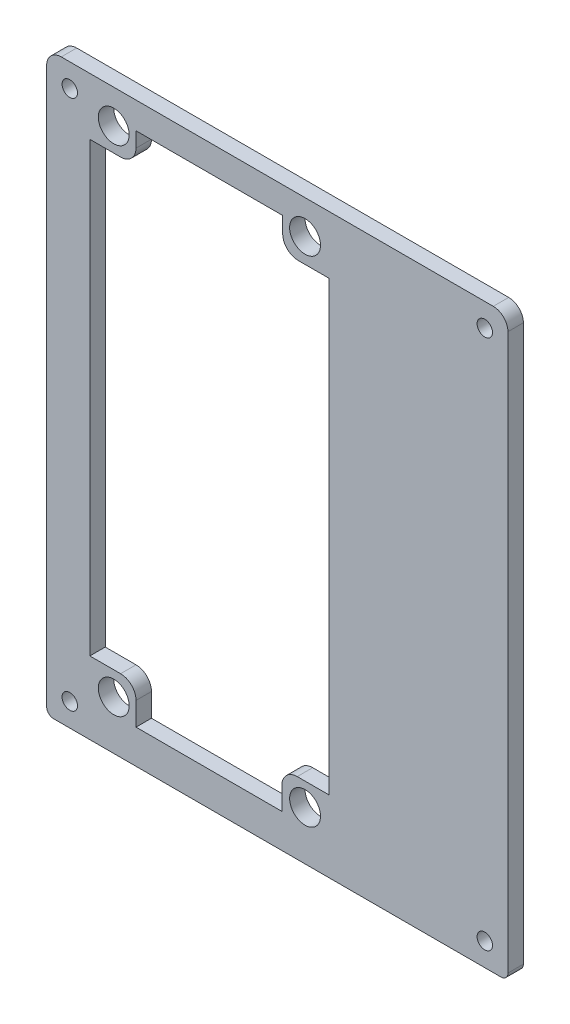
ISO-10303-21;
HEADER;
FILE_DESCRIPTION(('STEP AP214'),'2;1');
FILE_NAME('part.step','',(''),(''),'','','');
FILE_SCHEMA(('AUTOMOTIVE_DESIGN { 1 0 10303 214 1 1 1 1 }'));
ENDSEC;
DATA;
#1=APPLICATION_CONTEXT('core data for automotive mechanical design processes');
#2=APPLICATION_PROTOCOL_DEFINITION('international standard','automotive_design',2000,#1);
#3=PRODUCT_CONTEXT('',#1,'mechanical');
#4=PRODUCT('Part','Part','',(#3));
#5=PRODUCT_RELATED_PRODUCT_CATEGORY('part','',(#4));
#6=PRODUCT_DEFINITION_FORMATION('','',#4);
#7=PRODUCT_DEFINITION_CONTEXT('part definition',#1,'design');
#8=PRODUCT_DEFINITION('design','',#6,#7);
#9=PRODUCT_DEFINITION_SHAPE('','',#8);
#10=(LENGTH_UNIT() NAMED_UNIT(*) SI_UNIT(.MILLI.,.METRE.));
#11=(NAMED_UNIT(*) PLANE_ANGLE_UNIT() SI_UNIT($,.RADIAN.));
#12=(NAMED_UNIT(*) SI_UNIT($,.STERADIAN.) SOLID_ANGLE_UNIT());
#13=UNCERTAINTY_MEASURE_WITH_UNIT(LENGTH_MEASURE(1.E-05),#10,'distance_accuracy_value','');
#14=(GEOMETRIC_REPRESENTATION_CONTEXT(3) GLOBAL_UNCERTAINTY_ASSIGNED_CONTEXT((#13)) GLOBAL_UNIT_ASSIGNED_CONTEXT((#10,
#11,#12)) REPRESENTATION_CONTEXT('',''));
#15=CARTESIAN_POINT('',(0.,0.,0.));
#16=DIRECTION('',(0.,0.,1.));
#17=DIRECTION('',(1.,0.,0.));
#18=AXIS2_PLACEMENT_3D('',#15,#16,#17);
#19=CARTESIAN_POINT('',(-56.4735723656355,0.00392757981874936,2.));
#20=DIRECTION('',(0.,0.,-1.));
#21=DIRECTION('',(-1.,0.,0.));
#22=AXIS2_PLACEMENT_3D('',#19,#20,#21);
#23=PLANE('',#22);
#24=DIRECTION('',(0.,-1.,0.));
#25=VECTOR('',#24,1.);
#26=CARTESIAN_POINT('',(-45.7863826886566,0.00392757981874936,2.));
#27=LINE('',#26,#25);
#28=CARTESIAN_POINT('',(-45.7863826886566,6.50392757981872,2.));
#29=VERTEX_POINT('',#28);
#30=CARTESIAN_POINT('',(-45.7863826886566,3.50392757981873,2.));
#31=VERTEX_POINT('',#30);
#32=EDGE_CURVE('E540',#29,#31,#27,.T.);
#33=ORIENTED_EDGE('',*,*,#32,.F.);
#34=CARTESIAN_POINT('',(-47.7863826886566,6.50392757981872,2.));
#35=DIRECTION('',(0.,0.,-1.));
#36=DIRECTION('',(-1.,0.,0.));
#37=AXIS2_PLACEMENT_3D('',#34,#35,#36);
#38=CIRCLE('',#37,2.);
#39=CARTESIAN_POINT('',(-47.7863826886566,8.50392757981872,2.));
#40=VERTEX_POINT('',#39);
#41=EDGE_CURVE('E410',#29,#40,#38,.F.);
#42=ORIENTED_EDGE('',*,*,#41,.T.);
#43=DIRECTION('',(1.,0.,0.));
#44=VECTOR('',#43,1.);
#45=CARTESIAN_POINT('',(-56.4735723656355,8.50392757981872,2.));
#46=LINE('',#45,#44);
#47=CARTESIAN_POINT('',(-51.7735723656355,8.50392757981872,2.));
#48=VERTEX_POINT('',#47);
#49=EDGE_CURVE('E413',#48,#40,#46,.T.);
#50=ORIENTED_EDGE('',*,*,#49,.F.);
#51=DIRECTION('',(0.,-1.,0.));
#52=VECTOR('',#51,1.);
#53=CARTESIAN_POINT('',(-51.7735723656355,0.00392757981874985,2.));
#54=LINE('',#53,#52);
#55=CARTESIAN_POINT('',(-51.7735723656355,66.5039275798187,2.));
#56=VERTEX_POINT('',#55);
#57=EDGE_CURVE('E505',#56,#48,#54,.T.);
#58=ORIENTED_EDGE('',*,*,#57,.F.);
#59=DIRECTION('',(1.,0.,0.));
#60=VECTOR('',#59,1.);
#61=CARTESIAN_POINT('',(-56.4735723656355,66.5039275798187,2.));
#62=LINE('',#61,#60);
#63=CARTESIAN_POINT('',(-47.7863826886567,66.5039275798187,2.));
#64=VERTEX_POINT('',#63);
#65=EDGE_CURVE('E507',#56,#64,#62,.T.);
#66=ORIENTED_EDGE('',*,*,#65,.T.);
#67=CARTESIAN_POINT('',(-47.7863826886567,68.5039275798187,2.));
#68=DIRECTION('',(0.,0.,-1.));
#69=DIRECTION('',(-1.,0.,0.));
#70=AXIS2_PLACEMENT_3D('',#67,#68,#69);
#71=CIRCLE('',#70,2.);
#72=CARTESIAN_POINT('',(-45.7863826886567,68.5039275798187,2.));
#73=VERTEX_POINT('',#72);
#74=EDGE_CURVE('E510',#64,#73,#71,.F.);
#75=ORIENTED_EDGE('',*,*,#74,.T.);
#76=DIRECTION('',(0.,1.,0.));
#77=VECTOR('',#76,1.);
#78=CARTESIAN_POINT('',(-45.7863826886567,0.00392757981874936,2.));
#79=LINE('',#78,#77);
#80=CARTESIAN_POINT('',(-45.7863826886567,70.4539275798187,2.));
#81=VERTEX_POINT('',#80);
#82=EDGE_CURVE('E513',#73,#81,#79,.T.);
#83=ORIENTED_EDGE('',*,*,#82,.T.);
#84=DIRECTION('',(1.,0.,0.));
#85=VECTOR('',#84,1.);
#86=CARTESIAN_POINT('',(-56.4735723656355,70.4539275798187,2.));
#87=LINE('',#86,#85);
#88=CARTESIAN_POINT('',(-26.7735723656355,70.4539275798187,2.));
#89=VERTEX_POINT('',#88);
#90=EDGE_CURVE('E516',#81,#89,#87,.T.);
#91=ORIENTED_EDGE('',*,*,#90,.T.);
#92=DIRECTION('',(0.,-1.,0.));
#93=VECTOR('',#92,1.);
#94=CARTESIAN_POINT('',(-26.7735723656355,0.00392757981874936,2.));
#95=LINE('',#94,#93);
#96=CARTESIAN_POINT('',(-26.7735723656355,68.4039275798187,2.));
#97=VERTEX_POINT('',#96);
#98=EDGE_CURVE('E519',#89,#97,#95,.T.);
#99=ORIENTED_EDGE('',*,*,#98,.T.);
#100=CARTESIAN_POINT('',(-24.7735723656355,68.4039275798187,2.));
#101=DIRECTION('',(0.,0.,-1.));
#102=DIRECTION('',(-1.,0.,0.));
#103=AXIS2_PLACEMENT_3D('',#100,#101,#102);
#104=CIRCLE('',#103,2.00000000000001);
#105=CARTESIAN_POINT('',(-24.7735723656355,66.4039275798187,2.));
#106=VERTEX_POINT('',#105);
#107=EDGE_CURVE('E522',#106,#97,#104,.T.);
#108=ORIENTED_EDGE('',*,*,#107,.F.);
#109=DIRECTION('',(1.,0.,0.));
#110=VECTOR('',#109,1.);
#111=CARTESIAN_POINT('',(-56.4735723656357,66.4039275798186,2.));
#112=LINE('',#111,#110);
#113=CARTESIAN_POINT('',(-20.7735723656355,66.4039275798187,2.));
#114=VERTEX_POINT('',#113);
#115=EDGE_CURVE('E524',#106,#114,#112,.T.);
#116=ORIENTED_EDGE('',*,*,#115,.T.);
#117=DIRECTION('',(0.,-1.,0.));
#118=VECTOR('',#117,1.);
#119=CARTESIAN_POINT('',(-20.7735723656355,0.00392757981875311,2.));
#120=LINE('',#119,#118);
#121=CARTESIAN_POINT('',(-20.7735723656355,8.40392757981874,2.));
#122=VERTEX_POINT('',#121);
#123=EDGE_CURVE('E527',#114,#122,#120,.T.);
#124=ORIENTED_EDGE('',*,*,#123,.T.);
#125=DIRECTION('',(-1.,0.,0.));
#126=VECTOR('',#125,1.);
#127=CARTESIAN_POINT('',(-56.4735723656355,8.40392757981874,2.));
#128=LINE('',#127,#126);
#129=CARTESIAN_POINT('',(-24.8863826886566,8.40392757981874,2.));
#130=VERTEX_POINT('',#129);
#131=EDGE_CURVE('E530',#122,#130,#128,.T.);
#132=ORIENTED_EDGE('',*,*,#131,.T.);
#133=CARTESIAN_POINT('',(-24.8863826886566,6.40392757981874,2.));
#134=DIRECTION('',(0.,0.,-1.));
#135=DIRECTION('',(-1.,0.,0.));
#136=AXIS2_PLACEMENT_3D('',#133,#134,#135);
#137=CIRCLE('',#136,2.);
#138=CARTESIAN_POINT('',(-26.8863826886566,6.40392757981874,2.));
#139=VERTEX_POINT('',#138);
#140=EDGE_CURVE('E533',#139,#130,#137,.T.);
#141=ORIENTED_EDGE('',*,*,#140,.F.);
#142=DIRECTION('',(0.,-1.,0.));
#143=VECTOR('',#142,1.);
#144=CARTESIAN_POINT('',(-26.8863826886566,0.0039275798187237,2.));
#145=LINE('',#144,#143);
#146=CARTESIAN_POINT('',(-26.8863826886566,3.50392757981873,2.));
#147=VERTEX_POINT('',#146);
#148=EDGE_CURVE('E535',#139,#147,#145,.T.);
#149=ORIENTED_EDGE('',*,*,#148,.T.);
#150=DIRECTION('',(1.,0.,0.));
#151=VECTOR('',#150,1.);
#152=CARTESIAN_POINT('',(-56.4735723656355,3.50392757981873,2.));
#153=LINE('',#152,#151);
#154=EDGE_CURVE('E538',#31,#147,#153,.T.);
#155=ORIENTED_EDGE('',*,*,#154,.F.);
#156=EDGE_LOOP('',(#33,#42,#50,#58,#66,#75,#83,#91,#99,#108,#116,#124,#132,#141,#149,#155));
#157=FACE_BOUND('',#156,.T.);
#158=CARTESIAN_POINT('',(-56.4735723656355,0.00392757981874936,2.));
#159=DIRECTION('',(0.,0.,1.));
#160=DIRECTION('',(-1.,0.,0.));
#161=AXIS2_PLACEMENT_3D('',#158,#159,#160);
#162=CIRCLE('',#161,0.899999999999999);
#163=CARTESIAN_POINT('',(-57.3735723656355,0.00392757981874937,2.));
#164=VERTEX_POINT('',#163);
#165=CARTESIAN_POINT('',(-56.4735723656355,-0.896072420181251,2.));
#166=VERTEX_POINT('',#165);
#167=EDGE_CURVE('E580',#164,#166,#162,.T.);
#168=ORIENTED_EDGE('',*,*,#167,.T.);
#169=DIRECTION('',(1.,0.,0.));
#170=VECTOR('',#169,1.);
#171=CARTESIAN_POINT('',(-56.4735723656355,-0.896072420181251,2.));
#172=LINE('',#171,#170);
#173=CARTESIAN_POINT('',(1.52642763436448,-0.896072420181251,2.));
#174=VERTEX_POINT('',#173);
#175=EDGE_CURVE('E583',#166,#174,#172,.T.);
#176=ORIENTED_EDGE('',*,*,#175,.T.);
#177=CARTESIAN_POINT('',(1.52642763436448,0.00392757981874936,2.));
#178=DIRECTION('',(0.,0.,1.));
#179=DIRECTION('',(1.,0.,0.));
#180=AXIS2_PLACEMENT_3D('',#177,#178,#179);
#181=CIRCLE('',#180,0.9);
#182=CARTESIAN_POINT('',(2.42642763436448,0.00392757981874936,2.));
#183=VERTEX_POINT('',#182);
#184=EDGE_CURVE('E586',#174,#183,#181,.T.);
#185=ORIENTED_EDGE('',*,*,#184,.T.);
#186=DIRECTION('',(0.,1.,0.));
#187=VECTOR('',#186,1.);
#188=CARTESIAN_POINT('',(2.42642763436447,72.0039275798188,2.));
#189=LINE('',#188,#187);
#190=CARTESIAN_POINT('',(2.42642763436447,72.0039275798188,2.));
#191=VERTEX_POINT('',#190);
#192=EDGE_CURVE('E588',#183,#191,#189,.T.);
#193=ORIENTED_EDGE('',*,*,#192,.T.);
#194=CARTESIAN_POINT('',(0.526427634364474,72.0039275798188,2.));
#195=DIRECTION('',(0.,0.,1.));
#196=DIRECTION('',(1.,0.,0.));
#197=AXIS2_PLACEMENT_3D('',#194,#195,#196);
#198=CIRCLE('',#197,1.9);
#199=CARTESIAN_POINT('',(0.526427634364474,73.9039275798187,2.));
#200=VERTEX_POINT('',#199);
#201=EDGE_CURVE('E590',#191,#200,#198,.T.);
#202=ORIENTED_EDGE('',*,*,#201,.T.);
#203=DIRECTION('',(-1.,0.,0.));
#204=VECTOR('',#203,1.);
#205=CARTESIAN_POINT('',(-55.4735723656355,73.9039275798187,2.));
#206=LINE('',#205,#204);
#207=CARTESIAN_POINT('',(-55.4735723656355,73.9039275798187,2.));
#208=VERTEX_POINT('',#207);
#209=EDGE_CURVE('E592',#200,#208,#206,.T.);
#210=ORIENTED_EDGE('',*,*,#209,.T.);
#211=CARTESIAN_POINT('',(-55.4735723656355,72.0039275798188,2.));
#212=DIRECTION('',(0.,0.,1.));
#213=DIRECTION('',(-1.,0.,0.));
#214=AXIS2_PLACEMENT_3D('',#211,#212,#213);
#215=CIRCLE('',#214,1.9);
#216=CARTESIAN_POINT('',(-57.3735723656355,72.0039275798188,2.));
#217=VERTEX_POINT('',#216);
#218=EDGE_CURVE('E594',#208,#217,#215,.T.);
#219=ORIENTED_EDGE('',*,*,#218,.T.);
#220=DIRECTION('',(0.,-1.,0.));
#221=VECTOR('',#220,1.);
#222=CARTESIAN_POINT('',(-57.3735723656355,72.0039275798188,2.));
#223=LINE('',#222,#221);
#224=EDGE_CURVE('E596',#217,#164,#223,.T.);
#225=ORIENTED_EDGE('',*,*,#224,.T.);
#226=EDGE_LOOP('',(#168,#176,#185,#193,#202,#210,#219,#225));
#227=FACE_BOUND('',#226,.T.);
#228=CARTESIAN_POINT('',(-54.3735723656355,70.9039275798187,2.));
#229=DIRECTION('',(0.,0.,1.));
#230=DIRECTION('',(1.,0.,0.));
#231=AXIS2_PLACEMENT_3D('',#228,#229,#230);
#232=CIRCLE('',#231,0.999999999999998);
#233=CARTESIAN_POINT('',(-53.3735723656355,70.9039275798187,2.));
#234=VERTEX_POINT('',#233);
#235=EDGE_CURVE('E574',#234,#234,#232,.T.);
#236=ORIENTED_EDGE('',*,*,#235,.F.);
#237=EDGE_LOOP('',(#236));
#238=FACE_BOUND('',#237,.T.);
#239=CARTESIAN_POINT('',(-0.57357236563553,70.9039275798187,2.));
#240=DIRECTION('',(0.,0.,1.));
#241=DIRECTION('',(1.,0.,0.));
#242=AXIS2_PLACEMENT_3D('',#239,#240,#241);
#243=CIRCLE('',#242,1.);
#244=CARTESIAN_POINT('',(0.426427634364471,70.9039275798187,2.));
#245=VERTEX_POINT('',#244);
#246=EDGE_CURVE('E568',#245,#245,#243,.T.);
#247=ORIENTED_EDGE('',*,*,#246,.F.);
#248=EDGE_LOOP('',(#247));
#249=FACE_BOUND('',#248,.T.);
#250=CARTESIAN_POINT('',(-0.57357236563553,2.10392757981875,2.));
#251=DIRECTION('',(0.,0.,1.));
#252=DIRECTION('',(1.,0.,0.));
#253=AXIS2_PLACEMENT_3D('',#250,#251,#252);
#254=CIRCLE('',#253,1.);
#255=CARTESIAN_POINT('',(0.42642763436447,2.10392757981875,2.));
#256=VERTEX_POINT('',#255);
#257=EDGE_CURVE('E562',#256,#256,#254,.T.);
#258=ORIENTED_EDGE('',*,*,#257,.F.);
#259=EDGE_LOOP('',(#258));
#260=FACE_BOUND('',#259,.T.);
#261=CARTESIAN_POINT('',(-54.3735723656355,2.10392757981875,2.));
#262=DIRECTION('',(0.,0.,1.));
#263=DIRECTION('',(1.,0.,0.));
#264=AXIS2_PLACEMENT_3D('',#261,#262,#263);
#265=CIRCLE('',#264,0.999999999999998);
#266=CARTESIAN_POINT('',(-53.3735723656355,2.10392757981875,2.));
#267=VERTEX_POINT('',#266);
#268=EDGE_CURVE('E556',#267,#267,#265,.T.);
#269=ORIENTED_EDGE('',*,*,#268,.F.);
#270=EDGE_LOOP('',(#269));
#271=FACE_BOUND('',#270,.T.);
#272=CARTESIAN_POINT('',(-23.8735723656355,69.5539275798187,2.));
#273=DIRECTION('',(0.,0.,-1.));
#274=DIRECTION('',(-1.,0.,0.));
#275=AXIS2_PLACEMENT_3D('',#272,#273,#274);
#276=CIRCLE('',#275,2.);
#277=CARTESIAN_POINT('',(-25.8735723656355,69.5539275798187,2.));
#278=VERTEX_POINT('',#277);
#279=EDGE_CURVE('E543',#278,#278,#276,.F.);
#280=ORIENTED_EDGE('',*,*,#279,.F.);
#281=EDGE_LOOP('',(#280));
#282=FACE_BOUND('',#281,.T.);
#283=CARTESIAN_POINT('',(-48.6735723656355,69.5539275798187,2.));
#284=DIRECTION('',(0.,0.,-1.));
#285=DIRECTION('',(-1.,0.,0.));
#286=AXIS2_PLACEMENT_3D('',#283,#284,#285);
#287=CIRCLE('',#286,2.);
#288=CARTESIAN_POINT('',(-50.6735723656355,69.5539275798187,2.));
#289=VERTEX_POINT('',#288);
#290=EDGE_CURVE('E546',#289,#289,#287,.F.);
#291=ORIENTED_EDGE('',*,*,#290,.F.);
#292=EDGE_LOOP('',(#291));
#293=FACE_BOUND('',#292,.T.);
#294=CARTESIAN_POINT('',(-48.6735723656349,5.45392757981875,2.));
#295=DIRECTION('',(0.,0.,-1.));
#296=DIRECTION('',(-1.,0.,0.));
#297=AXIS2_PLACEMENT_3D('',#294,#295,#296);
#298=CIRCLE('',#297,2.);
#299=CARTESIAN_POINT('',(-50.6735723656349,5.45392757981875,2.));
#300=VERTEX_POINT('',#299);
#301=EDGE_CURVE('E549',#300,#300,#298,.F.);
#302=ORIENTED_EDGE('',*,*,#301,.F.);
#303=EDGE_LOOP('',(#302));
#304=FACE_BOUND('',#303,.T.);
#305=CARTESIAN_POINT('',(-23.8735723656349,5.45392757981875,2.));
#306=DIRECTION('',(0.,0.,-1.));
#307=DIRECTION('',(-1.,0.,0.));
#308=AXIS2_PLACEMENT_3D('',#305,#306,#307);
#309=CIRCLE('',#308,2.);
#310=CARTESIAN_POINT('',(-25.8735723656349,5.45392757981875,2.));
#311=VERTEX_POINT('',#310);
#312=EDGE_CURVE('E552',#311,#311,#309,.F.);
#313=ORIENTED_EDGE('',*,*,#312,.F.);
#314=EDGE_LOOP('',(#313));
#315=FACE_BOUND('',#314,.T.);
#316=ADVANCED_FACE('F246',(#157,#227,#238,#249,#260,#271,#282,#293,#304,#315),#23,.F.);
#317=CARTESIAN_POINT('',(-56.4735723656355,0.00392757981874936,0.));
#318=DIRECTION('',(0.,0.,-1.));
#319=DIRECTION('',(-1.,0.,0.));
#320=AXIS2_PLACEMENT_3D('',#317,#318,#319);
#321=PLANE('',#320);
#322=CARTESIAN_POINT('',(-48.6735723656349,5.45392757981875,0.));
#323=DIRECTION('',(0.,0.,1.));
#324=DIRECTION('',(1.,0.,0.));
#325=AXIS2_PLACEMENT_3D('',#322,#323,#324);
#326=CIRCLE('',#325,2.);
#327=CARTESIAN_POINT('',(-46.6735723656349,5.45392757981875,0.));
#328=VERTEX_POINT('',#327);
#329=EDGE_CURVE('E1081',#328,#328,#326,.T.);
#330=ORIENTED_EDGE('',*,*,#329,.T.);
#331=EDGE_LOOP('',(#330));
#332=FACE_BOUND('',#331,.T.);
#333=CARTESIAN_POINT('',(-23.8735723656355,69.5539275798187,0.));
#334=DIRECTION('',(0.,0.,1.));
#335=DIRECTION('',(1.,0.,0.));
#336=AXIS2_PLACEMENT_3D('',#333,#334,#335);
#337=CIRCLE('',#336,2.);
#338=CARTESIAN_POINT('',(-21.8735723656355,69.5539275798187,0.));
#339=VERTEX_POINT('',#338);
#340=EDGE_CURVE('E430',#339,#339,#337,.T.);
#341=ORIENTED_EDGE('',*,*,#340,.T.);
#342=EDGE_LOOP('',(#341));
#343=FACE_BOUND('',#342,.T.);
#344=CARTESIAN_POINT('',(-47.7863826886566,6.50392757981872,0.));
#345=DIRECTION('',(0.,0.,1.));
#346=DIRECTION('',(1.,0.,0.));
#347=AXIS2_PLACEMENT_3D('',#344,#345,#346);
#348=CIRCLE('',#347,2.);
#349=CARTESIAN_POINT('',(-45.7863826886566,6.50392757981872,0.));
#350=VERTEX_POINT('',#349);
#351=CARTESIAN_POINT('',(-47.7863826886566,8.50392757981872,0.));
#352=VERTEX_POINT('',#351);
#353=EDGE_CURVE('E269',#350,#352,#348,.T.);
#354=ORIENTED_EDGE('',*,*,#353,.F.);
#355=DIRECTION('',(0.,-1.,0.));
#356=VECTOR('',#355,1.);
#357=CARTESIAN_POINT('',(-45.7863826886566,0.,0.));
#358=LINE('',#357,#356);
#359=CARTESIAN_POINT('',(-45.7863826886566,3.50392757981873,0.));
#360=VERTEX_POINT('',#359);
#361=EDGE_CURVE('E417',#350,#360,#358,.T.);
#362=ORIENTED_EDGE('',*,*,#361,.T.);
#363=DIRECTION('',(1.,0.,0.));
#364=VECTOR('',#363,1.);
#365=CARTESIAN_POINT('',(0.,3.50392757981873,0.));
#366=LINE('',#365,#364);
#367=CARTESIAN_POINT('',(-26.8863826886566,3.50392757981873,0.));
#368=VERTEX_POINT('',#367);
#369=EDGE_CURVE('E423',#360,#368,#366,.T.);
#370=ORIENTED_EDGE('',*,*,#369,.T.);
#371=DIRECTION('',(0.,-1.,0.));
#372=VECTOR('',#371,1.);
#373=CARTESIAN_POINT('',(-26.8863826886566,0.,0.));
#374=LINE('',#373,#372);
#375=CARTESIAN_POINT('',(-26.8863826886566,6.40392757981874,0.));
#376=VERTEX_POINT('',#375);
#377=EDGE_CURVE('E440',#376,#368,#374,.T.);
#378=ORIENTED_EDGE('',*,*,#377,.F.);
#379=CARTESIAN_POINT('',(-24.8863826886566,6.40392757981874,0.));
#380=DIRECTION('',(0.,0.,1.));
#381=DIRECTION('',(1.,0.,0.));
#382=AXIS2_PLACEMENT_3D('',#379,#380,#381);
#383=CIRCLE('',#382,2.);
#384=CARTESIAN_POINT('',(-24.8863826886566,8.40392757981874,0.));
#385=VERTEX_POINT('',#384);
#386=EDGE_CURVE('E443',#376,#385,#383,.F.);
#387=ORIENTED_EDGE('',*,*,#386,.T.);
#388=DIRECTION('',(-1.,0.,0.));
#389=VECTOR('',#388,1.);
#390=CARTESIAN_POINT('',(0.,8.40392757981874,0.));
#391=LINE('',#390,#389);
#392=CARTESIAN_POINT('',(-20.7735723656355,8.40392757981874,0.));
#393=VERTEX_POINT('',#392);
#394=EDGE_CURVE('E446',#393,#385,#391,.T.);
#395=ORIENTED_EDGE('',*,*,#394,.F.);
#396=DIRECTION('',(0.,-1.,0.));
#397=VECTOR('',#396,1.);
#398=CARTESIAN_POINT('',(-20.7735723656355,0.,0.));
#399=LINE('',#398,#397);
#400=CARTESIAN_POINT('',(-20.7735723656355,66.4039275798187,0.));
#401=VERTEX_POINT('',#400);
#402=EDGE_CURVE('E449',#401,#393,#399,.T.);
#403=ORIENTED_EDGE('',*,*,#402,.F.);
#404=DIRECTION('',(1.,0.,0.));
#405=VECTOR('',#404,1.);
#406=CARTESIAN_POINT('',(-2.30384904139552E-13,66.4039275798188,0.));
#407=LINE('',#406,#405);
#408=CARTESIAN_POINT('',(-24.7735723656355,66.4039275798187,0.));
#409=VERTEX_POINT('',#408);
#410=EDGE_CURVE('E452',#409,#401,#407,.T.);
#411=ORIENTED_EDGE('',*,*,#410,.F.);
#412=CARTESIAN_POINT('',(-24.7735723656355,68.4039275798187,0.));
#413=DIRECTION('',(0.,0.,1.));
#414=DIRECTION('',(1.,0.,0.));
#415=AXIS2_PLACEMENT_3D('',#412,#413,#414);
#416=CIRCLE('',#415,2.00000000000001);
#417=CARTESIAN_POINT('',(-26.7735723656355,68.4039275798187,0.));
#418=VERTEX_POINT('',#417);
#419=EDGE_CURVE('E455',#409,#418,#416,.F.);
#420=ORIENTED_EDGE('',*,*,#419,.T.);
#421=DIRECTION('',(0.,-1.,0.));
#422=VECTOR('',#421,1.);
#423=CARTESIAN_POINT('',(-26.7735723656355,0.,0.));
#424=LINE('',#423,#422);
#425=CARTESIAN_POINT('',(-26.7735723656355,70.4539275798187,0.));
#426=VERTEX_POINT('',#425);
#427=EDGE_CURVE('E458',#426,#418,#424,.T.);
#428=ORIENTED_EDGE('',*,*,#427,.F.);
#429=DIRECTION('',(1.,0.,0.));
#430=VECTOR('',#429,1.);
#431=CARTESIAN_POINT('',(0.,70.4539275798187,0.));
#432=LINE('',#431,#430);
#433=CARTESIAN_POINT('',(-45.7863826886567,70.4539275798187,0.));
#434=VERTEX_POINT('',#433);
#435=EDGE_CURVE('E461',#434,#426,#432,.T.);
#436=ORIENTED_EDGE('',*,*,#435,.F.);
#437=DIRECTION('',(0.,1.,0.));
#438=VECTOR('',#437,1.);
#439=CARTESIAN_POINT('',(-45.7863826886567,0.,0.));
#440=LINE('',#439,#438);
#441=CARTESIAN_POINT('',(-45.7863826886567,68.5039275798187,0.));
#442=VERTEX_POINT('',#441);
#443=EDGE_CURVE('E464',#442,#434,#440,.T.);
#444=ORIENTED_EDGE('',*,*,#443,.F.);
#445=CARTESIAN_POINT('',(-47.7863826886567,68.5039275798187,0.));
#446=DIRECTION('',(0.,0.,1.));
#447=DIRECTION('',(1.,0.,0.));
#448=AXIS2_PLACEMENT_3D('',#445,#446,#447);
#449=CIRCLE('',#448,2.);
#450=CARTESIAN_POINT('',(-47.7863826886567,66.5039275798187,0.));
#451=VERTEX_POINT('',#450);
#452=EDGE_CURVE('E467',#451,#442,#449,.T.);
#453=ORIENTED_EDGE('',*,*,#452,.F.);
#454=DIRECTION('',(1.,0.,0.));
#455=VECTOR('',#454,1.);
#456=CARTESIAN_POINT('',(0.,66.5039275798187,0.));
#457=LINE('',#456,#455);
#458=CARTESIAN_POINT('',(-51.7735723656355,66.5039275798187,0.));
#459=VERTEX_POINT('',#458);
#460=EDGE_CURVE('E470',#459,#451,#457,.T.);
#461=ORIENTED_EDGE('',*,*,#460,.F.);
#462=DIRECTION('',(0.,-1.,0.));
#463=VECTOR('',#462,1.);
#464=CARTESIAN_POINT('',(-51.7735723656355,0.,0.));
#465=LINE('',#464,#463);
#466=CARTESIAN_POINT('',(-51.7735723656355,8.50392757981872,0.));
#467=VERTEX_POINT('',#466);
#468=EDGE_CURVE('E473',#459,#467,#465,.T.);
#469=ORIENTED_EDGE('',*,*,#468,.T.);
#470=DIRECTION('',(1.,0.,0.));
#471=VECTOR('',#470,1.);
#472=CARTESIAN_POINT('',(0.,8.5039275798187,0.));
#473=LINE('',#472,#471);
#474=EDGE_CURVE('E429',#467,#352,#473,.T.);
#475=ORIENTED_EDGE('',*,*,#474,.T.);
#476=EDGE_LOOP('',(#354,#362,#370,#378,#387,#395,#403,#411,#420,#428,#436,#444,#453,#461,#469,#475));
#477=FACE_BOUND('',#476,.T.);
#478=CARTESIAN_POINT('',(-0.57357236563553,2.10392757981875,0.));
#479=DIRECTION('',(0.,0.,1.));
#480=DIRECTION('',(1.,0.,0.));
#481=AXIS2_PLACEMENT_3D('',#478,#479,#480);
#482=CIRCLE('',#481,1.);
#483=CARTESIAN_POINT('',(0.42642763436447,2.10392757981875,0.));
#484=VERTEX_POINT('',#483);
#485=EDGE_CURVE('E559',#484,#484,#482,.T.);
#486=ORIENTED_EDGE('',*,*,#485,.T.);
#487=EDGE_LOOP('',(#486));
#488=FACE_BOUND('',#487,.T.);
#489=CARTESIAN_POINT('',(-54.3735723656355,70.9039275798187,0.));
#490=DIRECTION('',(0.,0.,1.));
#491=DIRECTION('',(1.,0.,0.));
#492=AXIS2_PLACEMENT_3D('',#489,#490,#491);
#493=CIRCLE('',#492,0.999999999999998);
#494=CARTESIAN_POINT('',(-53.3735723656355,70.9039275798187,0.));
#495=VERTEX_POINT('',#494);
#496=EDGE_CURVE('E571',#495,#495,#493,.T.);
#497=ORIENTED_EDGE('',*,*,#496,.T.);
#498=EDGE_LOOP('',(#497));
#499=FACE_BOUND('',#498,.T.);
#500=CARTESIAN_POINT('',(-56.4735723656355,0.00392757981874936,0.));
#501=DIRECTION('',(0.,0.,1.));
#502=DIRECTION('',(-1.,0.,0.));
#503=AXIS2_PLACEMENT_3D('',#500,#501,#502);
#504=CIRCLE('',#503,0.899999999999999);
#505=CARTESIAN_POINT('',(-57.3735723656355,0.00392757981874937,0.));
#506=VERTEX_POINT('',#505);
#507=CARTESIAN_POINT('',(-56.4735723656355,-0.896072420181251,0.));
#508=VERTEX_POINT('',#507);
#509=EDGE_CURVE('E577',#506,#508,#504,.T.);
#510=ORIENTED_EDGE('',*,*,#509,.F.);
#511=DIRECTION('',(0.,-1.,0.));
#512=VECTOR('',#511,1.);
#513=CARTESIAN_POINT('',(-57.3735723656355,72.0039275798188,0.));
#514=LINE('',#513,#512);
#515=CARTESIAN_POINT('',(-57.3735723656355,72.0039275798188,0.));
#516=VERTEX_POINT('',#515);
#517=EDGE_CURVE('E584',#516,#506,#514,.T.);
#518=ORIENTED_EDGE('',*,*,#517,.F.);
#519=CARTESIAN_POINT('',(-55.4735723656355,72.0039275798188,0.));
#520=DIRECTION('',(0.,0.,1.));
#521=DIRECTION('',(-1.,0.,0.));
#522=AXIS2_PLACEMENT_3D('',#519,#520,#521);
#523=CIRCLE('',#522,1.9);
#524=CARTESIAN_POINT('',(-55.4735723656355,73.9039275798187,0.));
#525=VERTEX_POINT('',#524);
#526=EDGE_CURVE('E611',#525,#516,#523,.T.);
#527=ORIENTED_EDGE('',*,*,#526,.F.);
#528=DIRECTION('',(-1.,0.,0.));
#529=VECTOR('',#528,1.);
#530=CARTESIAN_POINT('',(-55.4735723656355,73.9039275798187,0.));
#531=LINE('',#530,#529);
#532=CARTESIAN_POINT('',(0.526427634364474,73.9039275798187,0.));
#533=VERTEX_POINT('',#532);
#534=EDGE_CURVE('E609',#533,#525,#531,.T.);
#535=ORIENTED_EDGE('',*,*,#534,.F.);
#536=CARTESIAN_POINT('',(0.526427634364474,72.0039275798188,0.));
#537=DIRECTION('',(0.,0.,1.));
#538=DIRECTION('',(1.,0.,0.));
#539=AXIS2_PLACEMENT_3D('',#536,#537,#538);
#540=CIRCLE('',#539,1.9);
#541=CARTESIAN_POINT('',(2.42642763436447,72.0039275798188,0.));
#542=VERTEX_POINT('',#541);
#543=EDGE_CURVE('E607',#542,#533,#540,.T.);
#544=ORIENTED_EDGE('',*,*,#543,.F.);
#545=DIRECTION('',(0.,1.,0.));
#546=VECTOR('',#545,1.);
#547=CARTESIAN_POINT('',(2.42642763436447,72.0039275798188,0.));
#548=LINE('',#547,#546);
#549=CARTESIAN_POINT('',(2.42642763436448,0.00392757981874936,0.));
#550=VERTEX_POINT('',#549);
#551=EDGE_CURVE('E605',#550,#542,#548,.T.);
#552=ORIENTED_EDGE('',*,*,#551,.F.);
#553=CARTESIAN_POINT('',(1.52642763436448,0.00392757981874936,0.));
#554=DIRECTION('',(0.,0.,1.));
#555=DIRECTION('',(1.,0.,0.));
#556=AXIS2_PLACEMENT_3D('',#553,#554,#555);
#557=CIRCLE('',#556,0.9);
#558=CARTESIAN_POINT('',(1.52642763436448,-0.896072420181251,0.));
#559=VERTEX_POINT('',#558);
#560=EDGE_CURVE('E603',#559,#550,#557,.T.);
#561=ORIENTED_EDGE('',*,*,#560,.F.);
#562=DIRECTION('',(1.,0.,0.));
#563=VECTOR('',#562,1.);
#564=CARTESIAN_POINT('',(-56.4735723656355,-0.896072420181251,0.));
#565=LINE('',#564,#563);
#566=EDGE_CURVE('E601',#508,#559,#565,.T.);
#567=ORIENTED_EDGE('',*,*,#566,.F.);
#568=EDGE_LOOP('',(#510,#518,#527,#535,#544,#552,#561,#567));
#569=FACE_BOUND('',#568,.T.);
#570=CARTESIAN_POINT('',(-0.57357236563553,70.9039275798187,0.));
#571=DIRECTION('',(0.,0.,1.));
#572=DIRECTION('',(1.,0.,0.));
#573=AXIS2_PLACEMENT_3D('',#570,#571,#572);
#574=CIRCLE('',#573,1.);
#575=CARTESIAN_POINT('',(0.426427634364471,70.9039275798187,0.));
#576=VERTEX_POINT('',#575);
#577=EDGE_CURVE('E565',#576,#576,#574,.T.);
#578=ORIENTED_EDGE('',*,*,#577,.T.);
#579=EDGE_LOOP('',(#578));
#580=FACE_BOUND('',#579,.T.);
#581=CARTESIAN_POINT('',(-54.3735723656355,2.10392757981875,0.));
#582=DIRECTION('',(0.,0.,1.));
#583=DIRECTION('',(1.,0.,0.));
#584=AXIS2_PLACEMENT_3D('',#581,#582,#583);
#585=CIRCLE('',#584,0.999999999999998);
#586=CARTESIAN_POINT('',(-53.3735723656355,2.10392757981875,0.));
#587=VERTEX_POINT('',#586);
#588=EDGE_CURVE('E555',#587,#587,#585,.T.);
#589=ORIENTED_EDGE('',*,*,#588,.T.);
#590=EDGE_LOOP('',(#589));
#591=FACE_BOUND('',#590,.T.);
#592=CARTESIAN_POINT('',(-48.6735723656355,69.5539275798187,0.));
#593=DIRECTION('',(0.,0.,1.));
#594=DIRECTION('',(1.,0.,0.));
#595=AXIS2_PLACEMENT_3D('',#592,#593,#594);
#596=CIRCLE('',#595,2.);
#597=CARTESIAN_POINT('',(-46.6735723656355,69.5539275798187,0.));
#598=VERTEX_POINT('',#597);
#599=EDGE_CURVE('E433',#598,#598,#596,.T.);
#600=ORIENTED_EDGE('',*,*,#599,.T.);
#601=EDGE_LOOP('',(#600));
#602=FACE_BOUND('',#601,.T.);
#603=CARTESIAN_POINT('',(-23.8735723656349,5.45392757981875,0.));
#604=DIRECTION('',(0.,0.,1.));
#605=DIRECTION('',(1.,0.,0.));
#606=AXIS2_PLACEMENT_3D('',#603,#604,#605);
#607=CIRCLE('',#606,2.);
#608=CARTESIAN_POINT('',(-21.8735723656349,5.45392757981875,0.));
#609=VERTEX_POINT('',#608);
#610=EDGE_CURVE('E436',#609,#609,#607,.T.);
#611=ORIENTED_EDGE('',*,*,#610,.T.);
#612=EDGE_LOOP('',(#611));
#613=FACE_BOUND('',#612,.T.);
#614=ADVANCED_FACE('F426',(#332,#343,#477,#488,#499,#569,#580,#591,#602,#613),#321,.T.);
#615=CARTESIAN_POINT('',(-56.4735723656355,0.00392757981874936,2.));
#616=DIRECTION('',(0.,0.,-1.));
#617=DIRECTION('',(-1.,0.,0.));
#618=AXIS2_PLACEMENT_3D('',#615,#616,#617);
#619=CYLINDRICAL_SURFACE('',#618,0.899999999999999);
#620=ORIENTED_EDGE('',*,*,#509,.T.);
#621=DIRECTION('',(0.,0.,-1.));
#622=VECTOR('',#621,1.);
#623=CARTESIAN_POINT('',(-56.4735723656355,-0.896072420181251,2.));
#624=LINE('',#623,#622);
#625=EDGE_CURVE('E12',#166,#508,#624,.T.);
#626=ORIENTED_EDGE('',*,*,#625,.F.);
#627=ORIENTED_EDGE('',*,*,#167,.F.);
#628=DIRECTION('',(0.,0.,-1.));
#629=VECTOR('',#628,1.);
#630=CARTESIAN_POINT('',(-57.3735723656355,0.00392757981874937,2.));
#631=LINE('',#630,#629);
#632=EDGE_CURVE('E598',#164,#506,#631,.T.);
#633=ORIENTED_EDGE('',*,*,#632,.T.);
#634=EDGE_LOOP('',(#620,#626,#627,#633));
#635=FACE_BOUND('',#634,.T.);
#636=ADVANCED_FACE('F248',(#635),#619,.T.);
#637=CARTESIAN_POINT('',(-56.4735723656355,-0.896072420181251,2.));
#638=DIRECTION('',(0.,1.,0.));
#639=DIRECTION('',(0.,0.,1.));
#640=AXIS2_PLACEMENT_3D('',#637,#638,#639);
#641=PLANE('',#640);
#642=ORIENTED_EDGE('',*,*,#566,.T.);
#643=DIRECTION('',(0.,0.,-1.));
#644=VECTOR('',#643,1.);
#645=CARTESIAN_POINT('',(1.52642763436448,-0.896072420181251,2.));
#646=LINE('',#645,#644);
#647=EDGE_CURVE('E254',#174,#559,#646,.T.);
#648=ORIENTED_EDGE('',*,*,#647,.F.);
#649=ORIENTED_EDGE('',*,*,#175,.F.);
#650=ORIENTED_EDGE('',*,*,#625,.T.);
#651=EDGE_LOOP('',(#642,#648,#649,#650));
#652=FACE_BOUND('',#651,.T.);
#653=ADVANCED_FACE('F658',(#652),#641,.F.);
#654=CARTESIAN_POINT('',(1.52642763436448,0.00392757981874936,2.));
#655=DIRECTION('',(0.,0.,-1.));
#656=DIRECTION('',(-1.,0.,0.));
#657=AXIS2_PLACEMENT_3D('',#654,#655,#656);
#658=CYLINDRICAL_SURFACE('',#657,0.9);
#659=ORIENTED_EDGE('',*,*,#560,.T.);
#660=DIRECTION('',(0.,0.,-1.));
#661=VECTOR('',#660,1.);
#662=CARTESIAN_POINT('',(2.42642763436448,0.00392757981874936,2.));
#663=LINE('',#662,#661);
#664=EDGE_CURVE('E628',#183,#550,#663,.T.);
#665=ORIENTED_EDGE('',*,*,#664,.F.);
#666=ORIENTED_EDGE('',*,*,#184,.F.);
#667=ORIENTED_EDGE('',*,*,#647,.T.);
#668=EDGE_LOOP('',(#659,#665,#666,#667));
#669=FACE_BOUND('',#668,.T.);
#670=ADVANCED_FACE('F635',(#669),#658,.T.);
#671=CARTESIAN_POINT('',(2.42642763436447,72.0039275798188,2.));
#672=DIRECTION('',(-1.,0.,0.));
#673=DIRECTION('',(0.,-1.,0.));
#674=AXIS2_PLACEMENT_3D('',#671,#672,#673);
#675=PLANE('',#674);
#676=ORIENTED_EDGE('',*,*,#551,.T.);
#677=DIRECTION('',(0.,0.,-1.));
#678=VECTOR('',#677,1.);
#679=CARTESIAN_POINT('',(2.42642763436447,72.0039275798188,2.));
#680=LINE('',#679,#678);
#681=EDGE_CURVE('E625',#191,#542,#680,.T.);
#682=ORIENTED_EDGE('',*,*,#681,.F.);
#683=ORIENTED_EDGE('',*,*,#192,.F.);
#684=ORIENTED_EDGE('',*,*,#664,.T.);
#685=EDGE_LOOP('',(#676,#682,#683,#684));
#686=FACE_BOUND('',#685,.T.);
#687=ADVANCED_FACE('F646',(#686),#675,.F.);
#688=CARTESIAN_POINT('',(0.526427634364474,72.0039275798188,2.));
#689=DIRECTION('',(0.,0.,-1.));
#690=DIRECTION('',(-1.,0.,0.));
#691=AXIS2_PLACEMENT_3D('',#688,#689,#690);
#692=CYLINDRICAL_SURFACE('',#691,1.9);
#693=ORIENTED_EDGE('',*,*,#543,.T.);
#694=DIRECTION('',(0.,0.,-1.));
#695=VECTOR('',#694,1.);
#696=CARTESIAN_POINT('',(0.526427634364474,73.9039275798187,2.));
#697=LINE('',#696,#695);
#698=EDGE_CURVE('E622',#200,#533,#697,.T.);
#699=ORIENTED_EDGE('',*,*,#698,.F.);
#700=ORIENTED_EDGE('',*,*,#201,.F.);
#701=ORIENTED_EDGE('',*,*,#681,.T.);
#702=EDGE_LOOP('',(#693,#699,#700,#701));
#703=FACE_BOUND('',#702,.T.);
#704=ADVANCED_FACE('F650',(#703),#692,.T.);
#705=CARTESIAN_POINT('',(-55.4735723656355,73.9039275798187,2.));
#706=DIRECTION('',(0.,-1.,0.));
#707=DIRECTION('',(0.,0.,-1.));
#708=AXIS2_PLACEMENT_3D('',#705,#706,#707);
#709=PLANE('',#708);
#710=ORIENTED_EDGE('',*,*,#534,.T.);
#711=DIRECTION('',(0.,0.,-1.));
#712=VECTOR('',#711,1.);
#713=CARTESIAN_POINT('',(-55.4735723656355,73.9039275798187,2.));
#714=LINE('',#713,#712);
#715=EDGE_CURVE('E619',#208,#525,#714,.T.);
#716=ORIENTED_EDGE('',*,*,#715,.F.);
#717=ORIENTED_EDGE('',*,*,#209,.F.);
#718=ORIENTED_EDGE('',*,*,#698,.T.);
#719=EDGE_LOOP('',(#710,#716,#717,#718));
#720=FACE_BOUND('',#719,.T.);
#721=ADVANCED_FACE('F671',(#720),#709,.F.);
#722=CARTESIAN_POINT('',(-55.4735723656355,72.0039275798188,2.));
#723=DIRECTION('',(0.,0.,-1.));
#724=DIRECTION('',(-1.,0.,0.));
#725=AXIS2_PLACEMENT_3D('',#722,#723,#724);
#726=CYLINDRICAL_SURFACE('',#725,1.9);
#727=ORIENTED_EDGE('',*,*,#526,.T.);
#728=DIRECTION('',(0.,0.,-1.));
#729=VECTOR('',#728,1.);
#730=CARTESIAN_POINT('',(-57.3735723656355,72.0039275798188,2.));
#731=LINE('',#730,#729);
#732=EDGE_CURVE('E616',#217,#516,#731,.T.);
#733=ORIENTED_EDGE('',*,*,#732,.F.);
#734=ORIENTED_EDGE('',*,*,#218,.F.);
#735=ORIENTED_EDGE('',*,*,#715,.T.);
#736=EDGE_LOOP('',(#727,#733,#734,#735));
#737=FACE_BOUND('',#736,.T.);
#738=ADVANCED_FACE('F669',(#737),#726,.T.);
#739=CARTESIAN_POINT('',(-57.3735723656355,72.0039275798188,2.));
#740=DIRECTION('',(1.,0.,0.));
#741=DIRECTION('',(0.,1.,0.));
#742=AXIS2_PLACEMENT_3D('',#739,#740,#741);
#743=PLANE('',#742);
#744=ORIENTED_EDGE('',*,*,#517,.T.);
#745=ORIENTED_EDGE('',*,*,#632,.F.);
#746=ORIENTED_EDGE('',*,*,#224,.F.);
#747=ORIENTED_EDGE('',*,*,#732,.T.);
#748=EDGE_LOOP('',(#744,#745,#746,#747));
#749=FACE_BOUND('',#748,.T.);
#750=ADVANCED_FACE('F664',(#749),#743,.F.);
#751=CARTESIAN_POINT('',(-54.3735723656355,70.9039275798187,2.));
#752=DIRECTION('',(0.,0.,-1.));
#753=DIRECTION('',(-1.,0.,0.));
#754=AXIS2_PLACEMENT_3D('',#751,#752,#753);
#755=CYLINDRICAL_SURFACE('',#754,0.999999999999998);
#756=ORIENTED_EDGE('',*,*,#235,.T.);
#757=EDGE_LOOP('',(#756));
#758=FACE_BOUND('',#757,.T.);
#759=ORIENTED_EDGE('',*,*,#496,.F.);
#760=EDGE_LOOP('',(#759));
#761=FACE_BOUND('',#760,.T.);
#762=ADVANCED_FACE('F689',(#758,#761),#755,.F.);
#763=CARTESIAN_POINT('',(-0.57357236563553,70.9039275798187,2.));
#764=DIRECTION('',(0.,0.,-1.));
#765=DIRECTION('',(-1.,0.,0.));
#766=AXIS2_PLACEMENT_3D('',#763,#764,#765);
#767=CYLINDRICAL_SURFACE('',#766,1.);
#768=ORIENTED_EDGE('',*,*,#246,.T.);
#769=EDGE_LOOP('',(#768));
#770=FACE_BOUND('',#769,.T.);
#771=ORIENTED_EDGE('',*,*,#577,.F.);
#772=EDGE_LOOP('',(#771));
#773=FACE_BOUND('',#772,.T.);
#774=ADVANCED_FACE('F696',(#770,#773),#767,.F.);
#775=CARTESIAN_POINT('',(-0.57357236563553,2.10392757981875,2.));
#776=DIRECTION('',(0.,0.,-1.));
#777=DIRECTION('',(-1.,0.,0.));
#778=AXIS2_PLACEMENT_3D('',#775,#776,#777);
#779=CYLINDRICAL_SURFACE('',#778,1.);
#780=ORIENTED_EDGE('',*,*,#257,.T.);
#781=EDGE_LOOP('',(#780));
#782=FACE_BOUND('',#781,.T.);
#783=ORIENTED_EDGE('',*,*,#485,.F.);
#784=EDGE_LOOP('',(#783));
#785=FACE_BOUND('',#784,.T.);
#786=ADVANCED_FACE('F701',(#782,#785),#779,.F.);
#787=CARTESIAN_POINT('',(-54.3735723656355,2.10392757981875,2.));
#788=DIRECTION('',(0.,0.,-1.));
#789=DIRECTION('',(-1.,0.,0.));
#790=AXIS2_PLACEMENT_3D('',#787,#788,#789);
#791=CYLINDRICAL_SURFACE('',#790,0.999999999999998);
#792=ORIENTED_EDGE('',*,*,#268,.T.);
#793=EDGE_LOOP('',(#792));
#794=FACE_BOUND('',#793,.T.);
#795=ORIENTED_EDGE('',*,*,#588,.F.);
#796=EDGE_LOOP('',(#795));
#797=FACE_BOUND('',#796,.T.);
#798=ADVANCED_FACE('F796',(#794,#797),#791,.F.);
#799=CARTESIAN_POINT('',(-47.7863826886566,6.50392757981872,3.));
#800=DIRECTION('',(0.,0.,-1.));
#801=DIRECTION('',(-1.,0.,0.));
#802=AXIS2_PLACEMENT_3D('',#799,#800,#801);
#803=CYLINDRICAL_SURFACE('',#802,2.);
#804=DIRECTION('',(0.,0.,-1.));
#805=VECTOR('',#804,1.);
#806=CARTESIAN_POINT('',(-45.7863826886566,6.50392757981872,3.));
#807=LINE('',#806,#805);
#808=EDGE_CURVE('E406',#29,#350,#807,.T.);
#809=ORIENTED_EDGE('',*,*,#808,.T.);
#810=ORIENTED_EDGE('',*,*,#353,.T.);
#811=DIRECTION('',(0.,0.,-1.));
#812=VECTOR('',#811,1.);
#813=CARTESIAN_POINT('',(-47.7863826886566,8.50392757981872,3.));
#814=LINE('',#813,#812);
#815=EDGE_CURVE('E476',#40,#352,#814,.T.);
#816=ORIENTED_EDGE('',*,*,#815,.F.);
#817=ORIENTED_EDGE('',*,*,#41,.F.);
#818=EDGE_LOOP('',(#809,#810,#816,#817));
#819=FACE_BOUND('',#818,.T.);
#820=ADVANCED_FACE('F408',(#819),#803,.T.);
#821=CARTESIAN_POINT('',(-45.7863826886566,0.,3.));
#822=DIRECTION('',(1.,0.,0.));
#823=DIRECTION('',(0.,0.,-1.));
#824=AXIS2_PLACEMENT_3D('',#821,#822,#823);
#825=PLANE('',#824);
#826=ORIENTED_EDGE('',*,*,#32,.T.);
#827=DIRECTION('',(0.,0.,-1.));
#828=VECTOR('',#827,1.);
#829=CARTESIAN_POINT('',(-45.7863826886566,3.50392757981873,3.));
#830=LINE('',#829,#828);
#831=EDGE_CURVE('E414',#31,#360,#830,.T.);
#832=ORIENTED_EDGE('',*,*,#831,.T.);
#833=ORIENTED_EDGE('',*,*,#361,.F.);
#834=ORIENTED_EDGE('',*,*,#808,.F.);
#835=EDGE_LOOP('',(#826,#832,#833,#834));
#836=FACE_BOUND('',#835,.T.);
#837=ADVANCED_FACE('F418',(#836),#825,.T.);
#838=CARTESIAN_POINT('',(0.,3.50392757981873,3.));
#839=DIRECTION('',(0.,1.,0.));
#840=DIRECTION('',(-1.,0.,0.));
#841=AXIS2_PLACEMENT_3D('',#838,#839,#840);
#842=PLANE('',#841);
#843=ORIENTED_EDGE('',*,*,#154,.T.);
#844=DIRECTION('',(0.,0.,-1.));
#845=VECTOR('',#844,1.);
#846=CARTESIAN_POINT('',(-26.8863826886566,3.50392757981873,3.));
#847=LINE('',#846,#845);
#848=EDGE_CURVE('E501',#147,#368,#847,.T.);
#849=ORIENTED_EDGE('',*,*,#848,.T.);
#850=ORIENTED_EDGE('',*,*,#369,.F.);
#851=ORIENTED_EDGE('',*,*,#831,.F.);
#852=EDGE_LOOP('',(#843,#849,#850,#851));
#853=FACE_BOUND('',#852,.T.);
#854=ADVANCED_FACE('F787',(#853),#842,.T.);
#855=CARTESIAN_POINT('',(-26.8863826886566,0.,3.));
#856=DIRECTION('',(1.,0.,0.));
#857=DIRECTION('',(0.,1.,0.));
#858=AXIS2_PLACEMENT_3D('',#855,#856,#857);
#859=PLANE('',#858);
#860=DIRECTION('',(0.,0.,-1.));
#861=VECTOR('',#860,1.);
#862=CARTESIAN_POINT('',(-26.8863826886566,6.40392757981874,3.));
#863=LINE('',#862,#861);
#864=EDGE_CURVE('E499',#139,#376,#863,.T.);
#865=ORIENTED_EDGE('',*,*,#864,.T.);
#866=ORIENTED_EDGE('',*,*,#377,.T.);
#867=ORIENTED_EDGE('',*,*,#848,.F.);
#868=ORIENTED_EDGE('',*,*,#148,.F.);
#869=EDGE_LOOP('',(#865,#866,#867,#868));
#870=FACE_BOUND('',#869,.T.);
#871=ADVANCED_FACE('F783',(#870),#859,.F.);
#872=CARTESIAN_POINT('',(-24.8863826886566,6.40392757981874,3.));
#873=DIRECTION('',(0.,0.,-1.));
#874=DIRECTION('',(-1.,0.,0.));
#875=AXIS2_PLACEMENT_3D('',#872,#873,#874);
#876=CYLINDRICAL_SURFACE('',#875,2.);
#877=ORIENTED_EDGE('',*,*,#140,.T.);
#878=DIRECTION('',(0.,0.,-1.));
#879=VECTOR('',#878,1.);
#880=CARTESIAN_POINT('',(-24.8863826886566,8.40392757981874,3.));
#881=LINE('',#880,#879);
#882=EDGE_CURVE('E497',#130,#385,#881,.T.);
#883=ORIENTED_EDGE('',*,*,#882,.T.);
#884=ORIENTED_EDGE('',*,*,#386,.F.);
#885=ORIENTED_EDGE('',*,*,#864,.F.);
#886=EDGE_LOOP('',(#877,#883,#884,#885));
#887=FACE_BOUND('',#886,.T.);
#888=ADVANCED_FACE('F779',(#887),#876,.T.);
#889=CARTESIAN_POINT('',(0.,8.40392757981874,3.));
#890=DIRECTION('',(0.,-1.,0.));
#891=DIRECTION('',(0.,0.,-1.));
#892=AXIS2_PLACEMENT_3D('',#889,#890,#891);
#893=PLANE('',#892);
#894=DIRECTION('',(0.,0.,-1.));
#895=VECTOR('',#894,1.);
#896=CARTESIAN_POINT('',(-20.7735723656355,8.40392757981874,3.));
#897=LINE('',#896,#895);
#898=EDGE_CURVE('E495',#122,#393,#897,.T.);
#899=ORIENTED_EDGE('',*,*,#898,.T.);
#900=ORIENTED_EDGE('',*,*,#394,.T.);
#901=ORIENTED_EDGE('',*,*,#882,.F.);
#902=ORIENTED_EDGE('',*,*,#131,.F.);
#903=EDGE_LOOP('',(#899,#900,#901,#902));
#904=FACE_BOUND('',#903,.T.);
#905=ADVANCED_FACE('F775',(#904),#893,.F.);
#906=CARTESIAN_POINT('',(-20.7735723656355,0.,3.));
#907=DIRECTION('',(1.,0.,0.));
#908=DIRECTION('',(0.,1.,0.));
#909=AXIS2_PLACEMENT_3D('',#906,#907,#908);
#910=PLANE('',#909);
#911=DIRECTION('',(0.,0.,-1.));
#912=VECTOR('',#911,1.);
#913=CARTESIAN_POINT('',(-20.7735723656355,66.4039275798187,3.));
#914=LINE('',#913,#912);
#915=EDGE_CURVE('E493',#114,#401,#914,.T.);
#916=ORIENTED_EDGE('',*,*,#915,.T.);
#917=ORIENTED_EDGE('',*,*,#402,.T.);
#918=ORIENTED_EDGE('',*,*,#898,.F.);
#919=ORIENTED_EDGE('',*,*,#123,.F.);
#920=EDGE_LOOP('',(#916,#917,#918,#919));
#921=FACE_BOUND('',#920,.T.);
#922=ADVANCED_FACE('F771',(#921),#910,.F.);
#923=CARTESIAN_POINT('',(-2.30384904139552E-13,66.4039275798188,3.));
#924=DIRECTION('',(0.,1.,0.));
#925=DIRECTION('',(-1.,0.,0.));
#926=AXIS2_PLACEMENT_3D('',#923,#924,#925);
#927=PLANE('',#926);
#928=DIRECTION('',(0.,0.,-1.));
#929=VECTOR('',#928,1.);
#930=CARTESIAN_POINT('',(-24.7735723656355,66.4039275798187,3.));
#931=LINE('',#930,#929);
#932=EDGE_CURVE('E491',#106,#409,#931,.T.);
#933=ORIENTED_EDGE('',*,*,#932,.T.);
#934=ORIENTED_EDGE('',*,*,#410,.T.);
#935=ORIENTED_EDGE('',*,*,#915,.F.);
#936=ORIENTED_EDGE('',*,*,#115,.F.);
#937=EDGE_LOOP('',(#933,#934,#935,#936));
#938=FACE_BOUND('',#937,.T.);
#939=ADVANCED_FACE('F767',(#938),#927,.F.);
#940=CARTESIAN_POINT('',(-24.7735723656355,68.4039275798187,3.));
#941=DIRECTION('',(0.,0.,-1.));
#942=DIRECTION('',(-1.,0.,0.));
#943=AXIS2_PLACEMENT_3D('',#940,#941,#942);
#944=CYLINDRICAL_SURFACE('',#943,2.00000000000001);
#945=ORIENTED_EDGE('',*,*,#107,.T.);
#946=DIRECTION('',(0.,0.,-1.));
#947=VECTOR('',#946,1.);
#948=CARTESIAN_POINT('',(-26.7735723656355,68.4039275798187,3.));
#949=LINE('',#948,#947);
#950=EDGE_CURVE('E489',#97,#418,#949,.T.);
#951=ORIENTED_EDGE('',*,*,#950,.T.);
#952=ORIENTED_EDGE('',*,*,#419,.F.);
#953=ORIENTED_EDGE('',*,*,#932,.F.);
#954=EDGE_LOOP('',(#945,#951,#952,#953));
#955=FACE_BOUND('',#954,.T.);
#956=ADVANCED_FACE('F763',(#955),#944,.T.);
#957=CARTESIAN_POINT('',(-26.7735723656355,0.,3.));
#958=DIRECTION('',(1.,0.,0.));
#959=DIRECTION('',(0.,0.,-1.));
#960=AXIS2_PLACEMENT_3D('',#957,#958,#959);
#961=PLANE('',#960);
#962=DIRECTION('',(0.,0.,-1.));
#963=VECTOR('',#962,1.);
#964=CARTESIAN_POINT('',(-26.7735723656355,70.4539275798187,3.));
#965=LINE('',#964,#963);
#966=EDGE_CURVE('E487',#89,#426,#965,.T.);
#967=ORIENTED_EDGE('',*,*,#966,.T.);
#968=ORIENTED_EDGE('',*,*,#427,.T.);
#969=ORIENTED_EDGE('',*,*,#950,.F.);
#970=ORIENTED_EDGE('',*,*,#98,.F.);
#971=EDGE_LOOP('',(#967,#968,#969,#970));
#972=FACE_BOUND('',#971,.T.);
#973=ADVANCED_FACE('F759',(#972),#961,.F.);
#974=CARTESIAN_POINT('',(0.,70.4539275798187,3.));
#975=DIRECTION('',(0.,1.,0.));
#976=DIRECTION('',(0.,0.,1.));
#977=AXIS2_PLACEMENT_3D('',#974,#975,#976);
#978=PLANE('',#977);
#979=DIRECTION('',(0.,0.,-1.));
#980=VECTOR('',#979,1.);
#981=CARTESIAN_POINT('',(-45.7863826886567,70.4539275798187,3.));
#982=LINE('',#981,#980);
#983=EDGE_CURVE('E485',#81,#434,#982,.T.);
#984=ORIENTED_EDGE('',*,*,#983,.T.);
#985=ORIENTED_EDGE('',*,*,#435,.T.);
#986=ORIENTED_EDGE('',*,*,#966,.F.);
#987=ORIENTED_EDGE('',*,*,#90,.F.);
#988=EDGE_LOOP('',(#984,#985,#986,#987));
#989=FACE_BOUND('',#988,.T.);
#990=ADVANCED_FACE('F755',(#989),#978,.F.);
#991=CARTESIAN_POINT('',(-45.7863826886567,0.,3.));
#992=DIRECTION('',(-1.,0.,0.));
#993=DIRECTION('',(0.,0.,1.));
#994=AXIS2_PLACEMENT_3D('',#991,#992,#993);
#995=PLANE('',#994);
#996=DIRECTION('',(0.,0.,-1.));
#997=VECTOR('',#996,1.);
#998=CARTESIAN_POINT('',(-45.7863826886567,68.5039275798187,3.));
#999=LINE('',#998,#997);
#1000=EDGE_CURVE('E483',#73,#442,#999,.T.);
#1001=ORIENTED_EDGE('',*,*,#1000,.T.);
#1002=ORIENTED_EDGE('',*,*,#443,.T.);
#1003=ORIENTED_EDGE('',*,*,#983,.F.);
#1004=ORIENTED_EDGE('',*,*,#82,.F.);
#1005=EDGE_LOOP('',(#1001,#1002,#1003,#1004));
#1006=FACE_BOUND('',#1005,.T.);
#1007=ADVANCED_FACE('F751',(#1006),#995,.F.);
#1008=CARTESIAN_POINT('',(-47.7863826886567,68.5039275798187,3.));
#1009=DIRECTION('',(0.,0.,-1.));
#1010=DIRECTION('',(-1.,0.,0.));
#1011=AXIS2_PLACEMENT_3D('',#1008,#1009,#1010);
#1012=CYLINDRICAL_SURFACE('',#1011,2.);
#1013=DIRECTION('',(0.,0.,-1.));
#1014=VECTOR('',#1013,1.);
#1015=CARTESIAN_POINT('',(-47.7863826886567,66.5039275798187,3.));
#1016=LINE('',#1015,#1014);
#1017=EDGE_CURVE('E481',#64,#451,#1016,.T.);
#1018=ORIENTED_EDGE('',*,*,#1017,.T.);
#1019=ORIENTED_EDGE('',*,*,#452,.T.);
#1020=ORIENTED_EDGE('',*,*,#1000,.F.);
#1021=ORIENTED_EDGE('',*,*,#74,.F.);
#1022=EDGE_LOOP('',(#1018,#1019,#1020,#1021));
#1023=FACE_BOUND('',#1022,.T.);
#1024=ADVANCED_FACE('F747',(#1023),#1012,.T.);
#1025=CARTESIAN_POINT('',(0.,66.5039275798187,3.));
#1026=DIRECTION('',(0.,1.,0.));
#1027=DIRECTION('',(0.,0.,1.));
#1028=AXIS2_PLACEMENT_3D('',#1025,#1026,#1027);
#1029=PLANE('',#1028);
#1030=DIRECTION('',(0.,0.,-1.));
#1031=VECTOR('',#1030,1.);
#1032=CARTESIAN_POINT('',(-51.7735723656355,66.5039275798187,3.));
#1033=LINE('',#1032,#1031);
#1034=EDGE_CURVE('E479',#56,#459,#1033,.T.);
#1035=ORIENTED_EDGE('',*,*,#1034,.T.);
#1036=ORIENTED_EDGE('',*,*,#460,.T.);
#1037=ORIENTED_EDGE('',*,*,#1017,.F.);
#1038=ORIENTED_EDGE('',*,*,#65,.F.);
#1039=EDGE_LOOP('',(#1035,#1036,#1037,#1038));
#1040=FACE_BOUND('',#1039,.T.);
#1041=ADVANCED_FACE('F743',(#1040),#1029,.F.);
#1042=CARTESIAN_POINT('',(-51.7735723656355,0.,3.));
#1043=DIRECTION('',(1.,0.,0.));
#1044=DIRECTION('',(0.,1.,0.));
#1045=AXIS2_PLACEMENT_3D('',#1042,#1043,#1044);
#1046=PLANE('',#1045);
#1047=ORIENTED_EDGE('',*,*,#57,.T.);
#1048=DIRECTION('',(0.,0.,-1.));
#1049=VECTOR('',#1048,1.);
#1050=CARTESIAN_POINT('',(-51.7735723656355,8.50392757981872,3.));
#1051=LINE('',#1050,#1049);
#1052=EDGE_CURVE('E261',#48,#467,#1051,.T.);
#1053=ORIENTED_EDGE('',*,*,#1052,.T.);
#1054=ORIENTED_EDGE('',*,*,#468,.F.);
#1055=ORIENTED_EDGE('',*,*,#1034,.F.);
#1056=EDGE_LOOP('',(#1047,#1053,#1054,#1055));
#1057=FACE_BOUND('',#1056,.T.);
#1058=ADVANCED_FACE('F740',(#1057),#1046,.T.);
#1059=CARTESIAN_POINT('',(0.,8.5039275798187,3.));
#1060=DIRECTION('',(0.,1.,0.));
#1061=DIRECTION('',(-1.,0.,0.));
#1062=AXIS2_PLACEMENT_3D('',#1059,#1060,#1061);
#1063=PLANE('',#1062);
#1064=ORIENTED_EDGE('',*,*,#49,.T.);
#1065=ORIENTED_EDGE('',*,*,#815,.T.);
#1066=ORIENTED_EDGE('',*,*,#474,.F.);
#1067=ORIENTED_EDGE('',*,*,#1052,.F.);
#1068=EDGE_LOOP('',(#1064,#1065,#1066,#1067));
#1069=FACE_BOUND('',#1068,.T.);
#1070=ADVANCED_FACE('F736',(#1069),#1063,.T.);
#1071=CARTESIAN_POINT('',(-23.8735723656355,69.5539275798187,3.));
#1072=DIRECTION('',(0.,0.,-1.));
#1073=DIRECTION('',(-1.,0.,0.));
#1074=AXIS2_PLACEMENT_3D('',#1071,#1072,#1073);
#1075=CYLINDRICAL_SURFACE('',#1074,2.);
#1076=ORIENTED_EDGE('',*,*,#340,.F.);
#1077=EDGE_LOOP('',(#1076));
#1078=FACE_BOUND('',#1077,.T.);
#1079=ORIENTED_EDGE('',*,*,#279,.T.);
#1080=EDGE_LOOP('',(#1079));
#1081=FACE_BOUND('',#1080,.T.);
#1082=ADVANCED_FACE('F739',(#1078,#1081),#1075,.F.);
#1083=CARTESIAN_POINT('',(-48.6735723656355,69.5539275798187,3.));
#1084=DIRECTION('',(0.,0.,-1.));
#1085=DIRECTION('',(-1.,0.,0.));
#1086=AXIS2_PLACEMENT_3D('',#1083,#1084,#1085);
#1087=CYLINDRICAL_SURFACE('',#1086,2.);
#1088=ORIENTED_EDGE('',*,*,#599,.F.);
#1089=EDGE_LOOP('',(#1088));
#1090=FACE_BOUND('',#1089,.T.);
#1091=ORIENTED_EDGE('',*,*,#290,.T.);
#1092=EDGE_LOOP('',(#1091));
#1093=FACE_BOUND('',#1092,.T.);
#1094=ADVANCED_FACE('F730',(#1090,#1093),#1087,.F.);
#1095=CARTESIAN_POINT('',(-48.6735723656349,5.45392757981875,3.));
#1096=DIRECTION('',(0.,0.,-1.));
#1097=DIRECTION('',(-1.,0.,0.));
#1098=AXIS2_PLACEMENT_3D('',#1095,#1096,#1097);
#1099=CYLINDRICAL_SURFACE('',#1098,2.);
#1100=ORIENTED_EDGE('',*,*,#329,.F.);
#1101=EDGE_LOOP('',(#1100));
#1102=FACE_BOUND('',#1101,.T.);
#1103=ORIENTED_EDGE('',*,*,#301,.T.);
#1104=EDGE_LOOP('',(#1103));
#1105=FACE_BOUND('',#1104,.T.);
#1106=ADVANCED_FACE('F724',(#1102,#1105),#1099,.F.);
#1107=CARTESIAN_POINT('',(-23.8735723656349,5.45392757981875,3.));
#1108=DIRECTION('',(0.,0.,-1.));
#1109=DIRECTION('',(-1.,0.,0.));
#1110=AXIS2_PLACEMENT_3D('',#1107,#1108,#1109);
#1111=CYLINDRICAL_SURFACE('',#1110,2.);
#1112=ORIENTED_EDGE('',*,*,#610,.F.);
#1113=EDGE_LOOP('',(#1112));
#1114=FACE_BOUND('',#1113,.T.);
#1115=ORIENTED_EDGE('',*,*,#312,.T.);
#1116=EDGE_LOOP('',(#1115));
#1117=FACE_BOUND('',#1116,.T.);
#1118=ADVANCED_FACE('F722',(#1114,#1117),#1111,.F.);
#1119=CLOSED_SHELL('',(#316,#614,#636,#653,#670,#687,#704,#721,#738,#750,#762,#774,#786,#798,
#820,#837,#854,#871,#888,#905,#922,#939,#956,#973,#990,#1007,#1024,#1041,#1058,#1070,#1082,
#1094,#1106,#1118));
#1120=MANIFOLD_SOLID_BREP('B2',#1119);
#1121=ADVANCED_BREP_SHAPE_REPRESENTATION('',(#18,#1120),#14);
#1122=SHAPE_DEFINITION_REPRESENTATION(#9,#1121);
ENDSEC;
END-ISO-10303-21;
